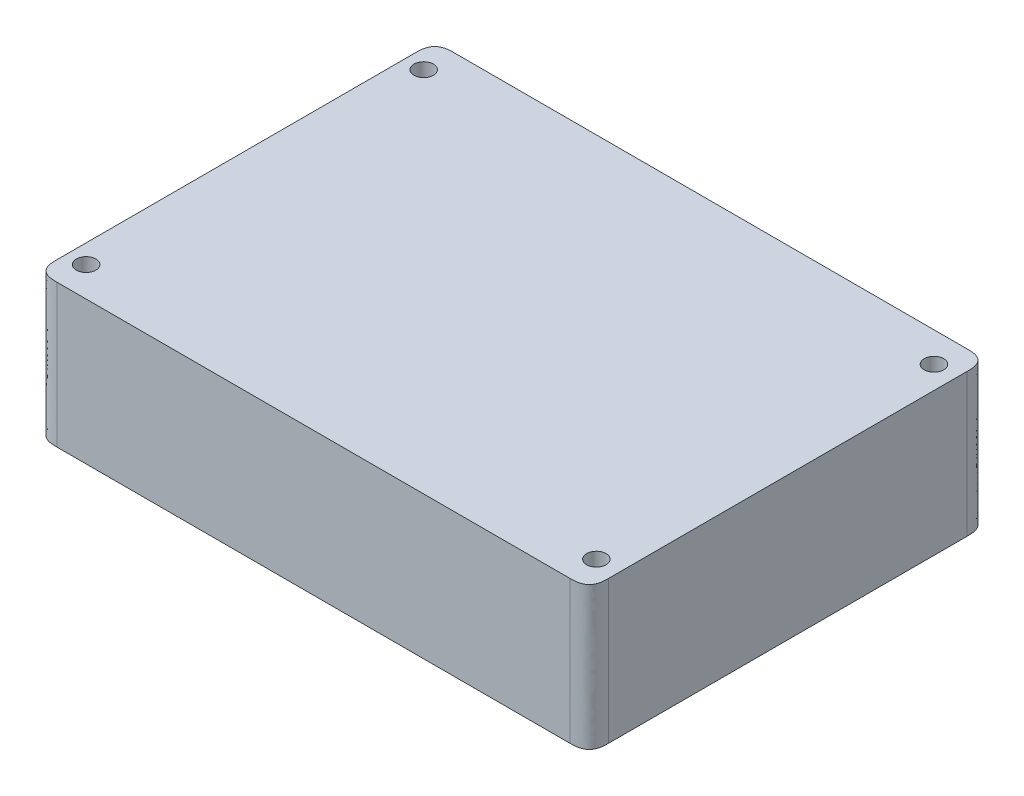
ISO-10303-21;
HEADER;
FILE_DESCRIPTION(('STEP AP214'),'2;1');
FILE_NAME('part.step','',(''),(''),'','','');
FILE_SCHEMA(('AUTOMOTIVE_DESIGN { 1 0 10303 214 1 1 1 1 }'));
ENDSEC;
DATA;
#1=APPLICATION_CONTEXT('core data for automotive mechanical design processes');
#2=APPLICATION_PROTOCOL_DEFINITION('international standard','automotive_design',2000,#1);
#3=PRODUCT_CONTEXT('',#1,'mechanical');
#4=PRODUCT('Part','Part','',(#3));
#5=PRODUCT_RELATED_PRODUCT_CATEGORY('part','',(#4));
#6=PRODUCT_DEFINITION_FORMATION('','',#4);
#7=PRODUCT_DEFINITION_CONTEXT('part definition',#1,'design');
#8=PRODUCT_DEFINITION('design','',#6,#7);
#9=PRODUCT_DEFINITION_SHAPE('','',#8);
#10=(LENGTH_UNIT() NAMED_UNIT(*) SI_UNIT(.MILLI.,.METRE.));
#11=(NAMED_UNIT(*) PLANE_ANGLE_UNIT() SI_UNIT($,.RADIAN.));
#12=(NAMED_UNIT(*) SI_UNIT($,.STERADIAN.) SOLID_ANGLE_UNIT());
#13=UNCERTAINTY_MEASURE_WITH_UNIT(LENGTH_MEASURE(1.E-05),#10,'distance_accuracy_value','');
#14=(GEOMETRIC_REPRESENTATION_CONTEXT(3) GLOBAL_UNCERTAINTY_ASSIGNED_CONTEXT((#13)) GLOBAL_UNIT_ASSIGNED_CONTEXT((#10,
#11,#12)) REPRESENTATION_CONTEXT('',''));
#15=CARTESIAN_POINT('',(0.,0.,0.));
#16=DIRECTION('',(0.,0.,1.));
#17=DIRECTION('',(1.,0.,0.));
#18=AXIS2_PLACEMENT_3D('',#15,#16,#17);
#19=CARTESIAN_POINT('',(0.,22.,0.));
#20=DIRECTION('',(0.,1.,0.));
#21=DIRECTION('',(0.,0.,1.));
#22=AXIS2_PLACEMENT_3D('',#19,#20,#21);
#23=PLANE('',#22);
#24=CARTESIAN_POINT('',(27.247027027027,22.,-21.6167567567567));
#25=DIRECTION('',(0.,1.,0.));
#26=DIRECTION('',(0.,0.,1.));
#27=AXIS2_PLACEMENT_3D('',#24,#25,#26);
#28=CIRCLE('',#27,1.5);
#29=CARTESIAN_POINT('',(27.247027027027,22.,-20.1167567567567));
#30=VERTEX_POINT('',#29);
#31=EDGE_CURVE('E262',#30,#30,#28,.T.);
#32=ORIENTED_EDGE('',*,*,#31,.F.);
#33=EDGE_LOOP('',(#32));
#34=FACE_BOUND('',#33,.T.);
#35=CARTESIAN_POINT('',(-51.352972972973,22.,-21.6167567567567));
#36=DIRECTION('',(0.,1.,0.));
#37=DIRECTION('',(0.,0.,1.));
#38=AXIS2_PLACEMENT_3D('',#35,#36,#37);
#39=CIRCLE('',#38,1.5);
#40=CARTESIAN_POINT('',(-51.352972972973,22.,-20.1167567567567));
#41=VERTEX_POINT('',#40);
#42=EDGE_CURVE('E155',#41,#41,#39,.T.);
#43=ORIENTED_EDGE('',*,*,#42,.F.);
#44=EDGE_LOOP('',(#43));
#45=FACE_BOUND('',#44,.T.);
#46=DIRECTION('',(-1.,0.,0.));
#47=VECTOR('',#46,1.);
#48=CARTESIAN_POINT('',(-54.252972972973,22.,-26.2167567567567));
#49=LINE('',#48,#47);
#50=CARTESIAN_POINT('',(27.747027027027,22.,-26.2167567567567));
#51=VERTEX_POINT('',#50);
#52=CARTESIAN_POINT('',(-51.252972972973,22.,-26.2167567567567));
#53=VERTEX_POINT('',#52);
#54=EDGE_CURVE('E218',#51,#53,#49,.T.);
#55=ORIENTED_EDGE('',*,*,#54,.T.);
#56=CARTESIAN_POINT('',(-54.252972972973,22.,-23.2167567567567));
#57=CARTESIAN_POINT('',(-54.252972972973,22.,-23.7213509113585));
#58=CARTESIAN_POINT('',(-54.252972972973,22.,-24.2259450659621));
#59=CARTESIAN_POINT('',(-54.0378972134682,22.,-25.3380771003164));
#60=CARTESIAN_POINT('',(-53.3742933165361,22.,-26.0016809972485));
#61=CARTESIAN_POINT('',(-52.2621612821837,22.,-26.2167567567567));
#62=CARTESIAN_POINT('',(-51.7575671275783,22.,-26.2167567567567));
#63=CARTESIAN_POINT('',(-51.252972972973,22.,-26.2167567567567));
#64=B_SPLINE_CURVE_WITH_KNOTS('',5,(#56,#57,#58,#59,#60,#61,#62,#63),.UNSPECIFIED.,.F.,.F.,(6,2,
6),(0.,0.5,1.),.UNSPECIFIED.);
#65=CARTESIAN_POINT('',(-54.252972972973,22.,-23.2167567567567));
#66=VERTEX_POINT('',#65);
#67=EDGE_CURVE('E356',#53,#66,#64,.F.);
#68=ORIENTED_EDGE('',*,*,#67,.T.);
#69=DIRECTION('',(0.,0.,1.));
#70=VECTOR('',#69,1.);
#71=CARTESIAN_POINT('',(-54.252972972973,22.,-26.2167567567567));
#72=LINE('',#71,#70);
#73=CARTESIAN_POINT('',(-54.252972972973,22.,31.9832432432433));
#74=VERTEX_POINT('',#73);
#75=EDGE_CURVE('E144',#66,#74,#72,.T.);
#76=ORIENTED_EDGE('',*,*,#75,.T.);
#77=CARTESIAN_POINT('',(-51.252972972973,22.,34.9832432432433));
#78=CARTESIAN_POINT('',(-51.7575671275749,22.,34.9832432432433));
#79=CARTESIAN_POINT('',(-52.2621612821767,22.,34.9832432432433));
#80=CARTESIAN_POINT('',(-53.3742933165327,22.,34.768167483735));
#81=CARTESIAN_POINT('',(-54.0378972134648,22.,34.1045635868029));
#82=CARTESIAN_POINT('',(-54.252972972973,22.,32.992431552447));
#83=CARTESIAN_POINT('',(-54.252972972973,22.,32.4878373978451));
#84=CARTESIAN_POINT('',(-54.252972972973,22.,31.9832432432433));
#85=B_SPLINE_CURVE_WITH_KNOTS('',5,(#77,#78,#79,#80,#81,#82,#83,#84),.UNSPECIFIED.,.F.,.F.,(6,2,
6),(0.,0.5,1.),.UNSPECIFIED.);
#86=CARTESIAN_POINT('',(-51.252972972973,22.,34.9832432432433));
#87=VERTEX_POINT('',#86);
#88=EDGE_CURVE('E353',#74,#87,#85,.F.);
#89=ORIENTED_EDGE('',*,*,#88,.T.);
#90=DIRECTION('',(1.,0.,0.));
#91=VECTOR('',#90,1.);
#92=CARTESIAN_POINT('',(-54.252972972973,22.,34.9832432432433));
#93=LINE('',#92,#91);
#94=CARTESIAN_POINT('',(27.747027027027,22.,34.9832432432433));
#95=VERTEX_POINT('',#94);
#96=EDGE_CURVE('E244',#87,#95,#93,.T.);
#97=ORIENTED_EDGE('',*,*,#96,.T.);
#98=CARTESIAN_POINT('',(30.747027027027,22.,31.9832432432433));
#99=CARTESIAN_POINT('',(30.747027027027,22.,32.4878373978451));
#100=CARTESIAN_POINT('',(30.747027027027,22.,32.992431552447));
#101=CARTESIAN_POINT('',(30.5319512675187,22.,34.1045635868029));
#102=CARTESIAN_POINT('',(29.8683473705866,22.,34.768167483735));
#103=CARTESIAN_POINT('',(28.7562153362307,22.,34.9832432432433));
#104=CARTESIAN_POINT('',(28.2516211816288,22.,34.9832432432433));
#105=CARTESIAN_POINT('',(27.747027027027,22.,34.9832432432433));
#106=B_SPLINE_CURVE_WITH_KNOTS('',5,(#98,#99,#100,#101,#102,#103,#104,#105),.UNSPECIFIED.,.F.,
.F.,(6,2,6),(0.,0.5,1.),.UNSPECIFIED.);
#107=CARTESIAN_POINT('',(30.747027027027,22.,31.9832432432433));
#108=VERTEX_POINT('',#107);
#109=EDGE_CURVE('E72',#95,#108,#106,.F.);
#110=ORIENTED_EDGE('',*,*,#109,.T.);
#111=DIRECTION('',(0.,0.,-1.));
#112=VECTOR('',#111,1.);
#113=CARTESIAN_POINT('',(30.747027027027,22.,-26.2167567567567));
#114=LINE('',#113,#112);
#115=CARTESIAN_POINT('',(30.747027027027,22.,-23.2167567567567));
#116=VERTEX_POINT('',#115);
#117=EDGE_CURVE('E226',#108,#116,#114,.T.);
#118=ORIENTED_EDGE('',*,*,#117,.T.);
#119=CARTESIAN_POINT('',(27.747027027027,22.,-26.2167567567567));
#120=CARTESIAN_POINT('',(28.2516211816288,22.,-26.2167567567567));
#121=CARTESIAN_POINT('',(28.7562153362307,22.,-26.2167567567567));
#122=CARTESIAN_POINT('',(29.8683473705866,22.,-26.0016809972485));
#123=CARTESIAN_POINT('',(30.5319512675187,22.,-25.3380771003164));
#124=CARTESIAN_POINT('',(30.747027027027,22.,-24.2259450659604));
#125=CARTESIAN_POINT('',(30.747027027027,22.,-23.7213509113586));
#126=CARTESIAN_POINT('',(30.747027027027,22.,-23.2167567567567));
#127=B_SPLINE_CURVE_WITH_KNOTS('',5,(#119,#120,#121,#122,#123,#124,#125,#126),.UNSPECIFIED.,.F.,
.F.,(6,2,6),(0.,0.5,1.),.UNSPECIFIED.);
#128=EDGE_CURVE('E362',#116,#51,#127,.F.);
#129=ORIENTED_EDGE('',*,*,#128,.T.);
#130=EDGE_LOOP('',(#55,#68,#76,#89,#97,#110,#118,#129));
#131=FACE_BOUND('',#130,.T.);
#132=CARTESIAN_POINT('',(-51.352972972973,22.,30.3832432432433));
#133=DIRECTION('',(0.,1.,0.));
#134=DIRECTION('',(0.,0.,1.));
#135=AXIS2_PLACEMENT_3D('',#132,#133,#134);
#136=CIRCLE('',#135,1.5);
#137=CARTESIAN_POINT('',(-51.352972972973,22.,31.8832432432433));
#138=VERTEX_POINT('',#137);
#139=EDGE_CURVE('E257',#138,#138,#136,.T.);
#140=ORIENTED_EDGE('',*,*,#139,.F.);
#141=EDGE_LOOP('',(#140));
#142=FACE_BOUND('',#141,.T.);
#143=CARTESIAN_POINT('',(27.247027027027,22.,30.3832432432433));
#144=DIRECTION('',(0.,1.,0.));
#145=DIRECTION('',(0.,0.,1.));
#146=AXIS2_PLACEMENT_3D('',#143,#144,#145);
#147=CIRCLE('',#146,1.5);
#148=CARTESIAN_POINT('',(27.247027027027,22.,31.8832432432433));
#149=VERTEX_POINT('',#148);
#150=EDGE_CURVE('E268',#149,#149,#147,.T.);
#151=ORIENTED_EDGE('',*,*,#150,.F.);
#152=EDGE_LOOP('',(#151));
#153=FACE_BOUND('',#152,.T.);
#154=ADVANCED_FACE('F43',(#34,#45,#131,#142,#153),#23,.T.);
#155=CARTESIAN_POINT('',(0.,0.,0.));
#156=DIRECTION('',(0.,1.,0.));
#157=DIRECTION('',(0.,0.,1.));
#158=AXIS2_PLACEMENT_3D('',#155,#156,#157);
#159=PLANE('',#158);
#160=DIRECTION('',(0.,0.,1.));
#161=VECTOR('',#160,1.);
#162=CARTESIAN_POINT('',(-54.252972972973,0.,-26.2167567567567));
#163=LINE('',#162,#161);
#164=CARTESIAN_POINT('',(-54.252972972973,0.,-23.2167567567567));
#165=VERTEX_POINT('',#164);
#166=CARTESIAN_POINT('',(-54.252972972973,0.,31.9832432432433));
#167=VERTEX_POINT('',#166);
#168=EDGE_CURVE('E141',#165,#167,#163,.T.);
#169=ORIENTED_EDGE('',*,*,#168,.F.);
#170=CARTESIAN_POINT('',(-51.252972972973,0.,-26.2167567567567));
#171=CARTESIAN_POINT('',(-51.757567127575,0.,-26.2167567567567));
#172=CARTESIAN_POINT('',(-52.262161282177,0.,-26.2167567567567));
#173=CARTESIAN_POINT('',(-53.3742933165328,0.,-26.0016809972485));
#174=CARTESIAN_POINT('',(-54.0378972134649,0.,-25.3380771003164));
#175=CARTESIAN_POINT('',(-54.252972972973,0.,-24.2259450659605));
#176=CARTESIAN_POINT('',(-54.252972972973,0.,-23.7213509113585));
#177=CARTESIAN_POINT('',(-54.252972972973,0.,-23.2167567567567));
#178=B_SPLINE_CURVE_WITH_KNOTS('',5,(#170,#171,#172,#173,#174,#175,#176,#177),.UNSPECIFIED.,.F.,
.F.,(6,2,6),(0.,0.5,1.),.UNSPECIFIED.);
#179=CARTESIAN_POINT('',(-51.252972972973,0.,-26.2167567567567));
#180=VERTEX_POINT('',#179);
#181=EDGE_CURVE('E118',#165,#180,#178,.F.);
#182=ORIENTED_EDGE('',*,*,#181,.T.);
#183=DIRECTION('',(-1.,0.,0.));
#184=VECTOR('',#183,1.);
#185=CARTESIAN_POINT('',(-54.252972972973,0.,-26.2167567567567));
#186=LINE('',#185,#184);
#187=CARTESIAN_POINT('',(27.747027027027,0.,-26.2167567567567));
#188=VERTEX_POINT('',#187);
#189=EDGE_CURVE('E324',#188,#180,#186,.T.);
#190=ORIENTED_EDGE('',*,*,#189,.F.);
#191=CARTESIAN_POINT('',(30.747027027027,0.,-23.2167567567567));
#192=CARTESIAN_POINT('',(30.747027027027,0.,-23.7213509113586));
#193=CARTESIAN_POINT('',(30.747027027027,0.,-24.2259450659604));
#194=CARTESIAN_POINT('',(30.5319512675187,0.,-25.3380771003164));
#195=CARTESIAN_POINT('',(29.8683473705866,0.,-26.0016809972485));
#196=CARTESIAN_POINT('',(28.7562153362307,0.,-26.2167567567567));
#197=CARTESIAN_POINT('',(28.2516211816288,0.,-26.2167567567567));
#198=CARTESIAN_POINT('',(27.747027027027,0.,-26.2167567567567));
#199=B_SPLINE_CURVE_WITH_KNOTS('',5,(#191,#192,#193,#194,#195,#196,#197,#198),.UNSPECIFIED.,.F.,
.F.,(6,2,6),(0.,0.5,1.),.UNSPECIFIED.);
#200=CARTESIAN_POINT('',(30.747027027027,0.,-23.2167567567567));
#201=VERTEX_POINT('',#200);
#202=EDGE_CURVE('E133',#188,#201,#199,.F.);
#203=ORIENTED_EDGE('',*,*,#202,.T.);
#204=DIRECTION('',(0.,0.,-1.));
#205=VECTOR('',#204,1.);
#206=CARTESIAN_POINT('',(30.747027027027,0.,-26.2167567567567));
#207=LINE('',#206,#205);
#208=CARTESIAN_POINT('',(30.747027027027,0.,31.9832432432433));
#209=VERTEX_POINT('',#208);
#210=EDGE_CURVE('E158',#209,#201,#207,.T.);
#211=ORIENTED_EDGE('',*,*,#210,.F.);
#212=CARTESIAN_POINT('',(27.747027027027,0.,34.9832432432433));
#213=CARTESIAN_POINT('',(28.2516211816288,0.,34.9832432432433));
#214=CARTESIAN_POINT('',(28.7562153362307,0.,34.9832432432433));
#215=CARTESIAN_POINT('',(29.8683473705866,0.,34.768167483735));
#216=CARTESIAN_POINT('',(30.5319512675187,0.,34.1045635868029));
#217=CARTESIAN_POINT('',(30.747027027027,0.,32.992431552447));
#218=CARTESIAN_POINT('',(30.747027027027,0.,32.4878373978451));
#219=CARTESIAN_POINT('',(30.747027027027,0.,31.9832432432433));
#220=B_SPLINE_CURVE_WITH_KNOTS('',5,(#212,#213,#214,#215,#216,#217,#218,#219),.UNSPECIFIED.,.F.,
.F.,(6,2,6),(0.,0.5,1.),.UNSPECIFIED.);
#221=CARTESIAN_POINT('',(27.747027027027,0.,34.9832432432433));
#222=VERTEX_POINT('',#221);
#223=EDGE_CURVE('E145',#209,#222,#220,.F.);
#224=ORIENTED_EDGE('',*,*,#223,.T.);
#225=DIRECTION('',(1.,0.,0.));
#226=VECTOR('',#225,1.);
#227=CARTESIAN_POINT('',(-54.252972972973,0.,34.9832432432433));
#228=LINE('',#227,#226);
#229=CARTESIAN_POINT('',(-51.252972972973,0.,34.9832432432433));
#230=VERTEX_POINT('',#229);
#231=EDGE_CURVE('E154',#230,#222,#228,.T.);
#232=ORIENTED_EDGE('',*,*,#231,.F.);
#233=CARTESIAN_POINT('',(-54.252972972973,0.,31.9832432432433));
#234=CARTESIAN_POINT('',(-54.252972972973,0.,32.4878373978451));
#235=CARTESIAN_POINT('',(-54.252972972973,0.,32.992431552447));
#236=CARTESIAN_POINT('',(-54.0378972134648,0.,34.1045635868029));
#237=CARTESIAN_POINT('',(-53.3742933165327,0.,34.768167483735));
#238=CARTESIAN_POINT('',(-52.2621612821767,0.,34.9832432432433));
#239=CARTESIAN_POINT('',(-51.7575671275748,0.,34.9832432432433));
#240=CARTESIAN_POINT('',(-51.252972972973,0.,34.9832432432433));
#241=B_SPLINE_CURVE_WITH_KNOTS('',5,(#233,#234,#235,#236,#237,#238,#239,#240),.UNSPECIFIED.,.F.,
.F.,(6,2,6),(0.,0.5,1.),.UNSPECIFIED.);
#242=EDGE_CURVE('E152',#230,#167,#241,.F.);
#243=ORIENTED_EDGE('',*,*,#242,.T.);
#244=EDGE_LOOP('',(#169,#182,#190,#203,#211,#224,#232,#243));
#245=FACE_BOUND('',#244,.T.);
#246=CARTESIAN_POINT('',(-51.352972972973,0.,-21.6167567567567));
#247=DIRECTION('',(0.,1.,0.));
#248=DIRECTION('',(0.,0.,1.));
#249=AXIS2_PLACEMENT_3D('',#246,#247,#248);
#250=CIRCLE('',#249,1.5);
#251=CARTESIAN_POINT('',(-51.352972972973,0.,-20.1167567567567));
#252=VERTEX_POINT('',#251);
#253=EDGE_CURVE('E161',#252,#252,#250,.T.);
#254=ORIENTED_EDGE('',*,*,#253,.T.);
#255=EDGE_LOOP('',(#254));
#256=FACE_BOUND('',#255,.T.);
#257=CARTESIAN_POINT('',(-51.352972972973,0.,30.3832432432433));
#258=DIRECTION('',(0.,1.,0.));
#259=DIRECTION('',(0.,0.,1.));
#260=AXIS2_PLACEMENT_3D('',#257,#258,#259);
#261=CIRCLE('',#260,1.5);
#262=CARTESIAN_POINT('',(-51.352972972973,0.,31.8832432432433));
#263=VERTEX_POINT('',#262);
#264=EDGE_CURVE('E259',#263,#263,#261,.T.);
#265=ORIENTED_EDGE('',*,*,#264,.T.);
#266=EDGE_LOOP('',(#265));
#267=FACE_BOUND('',#266,.T.);
#268=CARTESIAN_POINT('',(27.247027027027,0.,-21.6167567567567));
#269=DIRECTION('',(0.,1.,0.));
#270=DIRECTION('',(0.,0.,1.));
#271=AXIS2_PLACEMENT_3D('',#268,#269,#270);
#272=CIRCLE('',#271,1.5);
#273=CARTESIAN_POINT('',(27.247027027027,0.,-20.1167567567567));
#274=VERTEX_POINT('',#273);
#275=EDGE_CURVE('E265',#274,#274,#272,.T.);
#276=ORIENTED_EDGE('',*,*,#275,.T.);
#277=EDGE_LOOP('',(#276));
#278=FACE_BOUND('',#277,.T.);
#279=CARTESIAN_POINT('',(27.247027027027,0.,30.3832432432433));
#280=DIRECTION('',(0.,1.,0.));
#281=DIRECTION('',(0.,0.,1.));
#282=AXIS2_PLACEMENT_3D('',#279,#280,#281);
#283=CIRCLE('',#282,1.5);
#284=CARTESIAN_POINT('',(27.247027027027,0.,31.8832432432433));
#285=VERTEX_POINT('',#284);
#286=EDGE_CURVE('E271',#285,#285,#283,.T.);
#287=ORIENTED_EDGE('',*,*,#286,.T.);
#288=EDGE_LOOP('',(#287));
#289=FACE_BOUND('',#288,.T.);
#290=ADVANCED_FACE('F149',(#245,#256,#267,#278,#289),#159,.F.);
#291=CARTESIAN_POINT('',(-54.252972972973,22.,-26.2167567567567));
#292=DIRECTION('',(1.,0.,0.));
#293=DIRECTION('',(0.,0.,-1.));
#294=AXIS2_PLACEMENT_3D('',#291,#292,#293);
#295=PLANE('',#294);
#296=ORIENTED_EDGE('',*,*,#75,.F.);
#297=CARTESIAN_POINT('',(-54.252972972973,-1.1,-23.2167567567567));
#298=CARTESIAN_POINT('',(-54.252972972973,6.96666666666667,-23.2167567567567));
#299=CARTESIAN_POINT('',(-54.252972972973,15.0333333333106,-23.2167567567567));
#300=CARTESIAN_POINT('',(-54.252972972973,23.1,-23.2167567567567));
#301=B_SPLINE_CURVE_WITH_KNOTS('',3,(#297,#298,#299,#300),.UNSPECIFIED.,.F.,.F.,(4,4),(-0.0011,
0.0231),.UNSPECIFIED.);
#302=EDGE_CURVE('E123',#66,#165,#301,.F.);
#303=ORIENTED_EDGE('',*,*,#302,.T.);
#304=ORIENTED_EDGE('',*,*,#168,.T.);
#305=CARTESIAN_POINT('',(-54.252972972973,23.1,31.9832432432433));
#306=CARTESIAN_POINT('',(-54.252972972973,15.0333333333106,31.9832432432433));
#307=CARTESIAN_POINT('',(-54.252972972973,6.96666666666667,31.9832432432433));
#308=CARTESIAN_POINT('',(-54.252972972973,-1.1,31.9832432432433));
#309=B_SPLINE_CURVE_WITH_KNOTS('',3,(#305,#306,#307,#308),.UNSPECIFIED.,.F.,.F.,(4,4),(-0.0011,
0.0231),.UNSPECIFIED.);
#310=EDGE_CURVE('E146',#167,#74,#309,.F.);
#311=ORIENTED_EDGE('',*,*,#310,.T.);
#312=EDGE_LOOP('',(#296,#303,#304,#311));
#313=FACE_BOUND('',#312,.T.);
#314=ADVANCED_FACE('F140',(#313),#295,.F.);
#315=CARTESIAN_POINT('',(-54.252972972973,22.,34.9832432432433));
#316=DIRECTION('',(0.,0.,-1.));
#317=DIRECTION('',(-1.,0.,0.));
#318=AXIS2_PLACEMENT_3D('',#315,#316,#317);
#319=PLANE('',#318);
#320=ORIENTED_EDGE('',*,*,#96,.F.);
#321=CARTESIAN_POINT('',(-51.252972972973,-1.1,34.9832432432433));
#322=CARTESIAN_POINT('',(-51.252972972973,6.96666666666667,34.9832432432433));
#323=CARTESIAN_POINT('',(-51.252972972973,15.0333333333106,34.9832432432433));
#324=CARTESIAN_POINT('',(-51.252972972973,23.1,34.9832432432433));
#325=B_SPLINE_CURVE_WITH_KNOTS('',3,(#321,#322,#323,#324),.UNSPECIFIED.,.F.,.F.,(4,4),(-0.0011,
0.0231),.UNSPECIFIED.);
#326=EDGE_CURVE('E11',#87,#230,#325,.F.);
#327=ORIENTED_EDGE('',*,*,#326,.T.);
#328=ORIENTED_EDGE('',*,*,#231,.T.);
#329=CARTESIAN_POINT('',(27.747027027027,23.1,34.9832432432433));
#330=CARTESIAN_POINT('',(27.747027027027,15.0333333333106,34.9832432432433));
#331=CARTESIAN_POINT('',(27.747027027027,6.96666666666667,34.9832432432433));
#332=CARTESIAN_POINT('',(27.747027027027,-1.1,34.9832432432433));
#333=B_SPLINE_CURVE_WITH_KNOTS('',3,(#329,#330,#331,#332),.UNSPECIFIED.,.F.,.F.,(4,4),(-0.0011,
0.0231),.UNSPECIFIED.);
#334=EDGE_CURVE('E57',#222,#95,#333,.F.);
#335=ORIENTED_EDGE('',*,*,#334,.T.);
#336=EDGE_LOOP('',(#320,#327,#328,#335));
#337=FACE_BOUND('',#336,.T.);
#338=ADVANCED_FACE('F323',(#337),#319,.F.);
#339=CARTESIAN_POINT('',(30.747027027027,22.,-26.2167567567567));
#340=DIRECTION('',(-1.,0.,0.));
#341=DIRECTION('',(0.,0.,1.));
#342=AXIS2_PLACEMENT_3D('',#339,#340,#341);
#343=PLANE('',#342);
#344=ORIENTED_EDGE('',*,*,#210,.T.);
#345=CARTESIAN_POINT('',(30.747027027027,23.1,-23.2167567567567));
#346=CARTESIAN_POINT('',(30.747027027027,15.0333333333106,-23.2167567567567));
#347=CARTESIAN_POINT('',(30.747027027027,6.96666666666667,-23.2167567567567));
#348=CARTESIAN_POINT('',(30.747027027027,-1.1,-23.2167567567567));
#349=B_SPLINE_CURVE_WITH_KNOTS('',3,(#345,#346,#347,#348),.UNSPECIFIED.,.F.,.F.,(4,4),(-0.0011,
0.0231),.UNSPECIFIED.);
#350=EDGE_CURVE('E64',#201,#116,#349,.F.);
#351=ORIENTED_EDGE('',*,*,#350,.T.);
#352=ORIENTED_EDGE('',*,*,#117,.F.);
#353=CARTESIAN_POINT('',(30.747027027027,-1.1,31.9832432432433));
#354=CARTESIAN_POINT('',(30.747027027027,6.96666666666667,31.9832432432433));
#355=CARTESIAN_POINT('',(30.747027027027,15.0333333333106,31.9832432432433));
#356=CARTESIAN_POINT('',(30.747027027027,23.1,31.9832432432433));
#357=B_SPLINE_CURVE_WITH_KNOTS('',3,(#353,#354,#355,#356),.UNSPECIFIED.,.F.,.F.,(4,4),(-0.0011,
0.0231),.UNSPECIFIED.);
#358=EDGE_CURVE('E420',#108,#209,#357,.F.);
#359=ORIENTED_EDGE('',*,*,#358,.T.);
#360=EDGE_LOOP('',(#344,#351,#352,#359));
#361=FACE_BOUND('',#360,.T.);
#362=ADVANCED_FACE('F317',(#361),#343,.F.);
#363=CARTESIAN_POINT('',(-54.252972972973,22.,-26.2167567567567));
#364=DIRECTION('',(0.,0.,1.));
#365=DIRECTION('',(1.,0.,0.));
#366=AXIS2_PLACEMENT_3D('',#363,#364,#365);
#367=PLANE('',#366);
#368=ORIENTED_EDGE('',*,*,#189,.T.);
#369=CARTESIAN_POINT('',(-51.252972972973,23.1,-26.2167567567567));
#370=CARTESIAN_POINT('',(-51.252972972973,15.0333333333106,-26.2167567567567));
#371=CARTESIAN_POINT('',(-51.252972972973,6.96666666666667,-26.2167567567567));
#372=CARTESIAN_POINT('',(-51.252972972973,-1.1,-26.2167567567567));
#373=B_SPLINE_CURVE_WITH_KNOTS('',3,(#369,#370,#371,#372),.UNSPECIFIED.,.F.,.F.,(4,4),(-0.0011,
0.0231),.UNSPECIFIED.);
#374=EDGE_CURVE('E125',#180,#53,#373,.F.);
#375=ORIENTED_EDGE('',*,*,#374,.T.);
#376=ORIENTED_EDGE('',*,*,#54,.F.);
#377=CARTESIAN_POINT('',(27.747027027027,-1.1,-26.2167567567567));
#378=CARTESIAN_POINT('',(27.747027027027,6.96666666666667,-26.2167567567567));
#379=CARTESIAN_POINT('',(27.747027027027,15.0333333333106,-26.2167567567567));
#380=CARTESIAN_POINT('',(27.747027027027,23.1,-26.2167567567567));
#381=B_SPLINE_CURVE_WITH_KNOTS('',3,(#377,#378,#379,#380),.UNSPECIFIED.,.F.,.F.,(4,4),(-0.0011,
0.0231),.UNSPECIFIED.);
#382=EDGE_CURVE('E132',#51,#188,#381,.F.);
#383=ORIENTED_EDGE('',*,*,#382,.T.);
#384=EDGE_LOOP('',(#368,#375,#376,#383));
#385=FACE_BOUND('',#384,.T.);
#386=ADVANCED_FACE('F197',(#385),#367,.F.);
#387=CARTESIAN_POINT('',(-51.352972972973,22.,-21.6167567567567));
#388=DIRECTION('',(0.,-1.,0.));
#389=DIRECTION('',(0.,0.,-1.));
#390=AXIS2_PLACEMENT_3D('',#387,#388,#389);
#391=CYLINDRICAL_SURFACE('',#390,1.5);
#392=ORIENTED_EDGE('',*,*,#42,.T.);
#393=EDGE_LOOP('',(#392));
#394=FACE_BOUND('',#393,.T.);
#395=ORIENTED_EDGE('',*,*,#253,.F.);
#396=EDGE_LOOP('',(#395));
#397=FACE_BOUND('',#396,.T.);
#398=ADVANCED_FACE('F294',(#394,#397),#391,.F.);
#399=CARTESIAN_POINT('',(-51.352972972973,22.,30.3832432432433));
#400=DIRECTION('',(0.,-1.,0.));
#401=DIRECTION('',(0.,0.,-1.));
#402=AXIS2_PLACEMENT_3D('',#399,#400,#401);
#403=CYLINDRICAL_SURFACE('',#402,1.5);
#404=ORIENTED_EDGE('',*,*,#139,.T.);
#405=EDGE_LOOP('',(#404));
#406=FACE_BOUND('',#405,.T.);
#407=ORIENTED_EDGE('',*,*,#264,.F.);
#408=EDGE_LOOP('',(#407));
#409=FACE_BOUND('',#408,.T.);
#410=ADVANCED_FACE('F290',(#406,#409),#403,.F.);
#411=CARTESIAN_POINT('',(27.247027027027,22.,-21.6167567567567));
#412=DIRECTION('',(0.,-1.,0.));
#413=DIRECTION('',(0.,0.,-1.));
#414=AXIS2_PLACEMENT_3D('',#411,#412,#413);
#415=CYLINDRICAL_SURFACE('',#414,1.5);
#416=ORIENTED_EDGE('',*,*,#31,.T.);
#417=EDGE_LOOP('',(#416));
#418=FACE_BOUND('',#417,.T.);
#419=ORIENTED_EDGE('',*,*,#275,.F.);
#420=EDGE_LOOP('',(#419));
#421=FACE_BOUND('',#420,.T.);
#422=ADVANCED_FACE('F293',(#418,#421),#415,.F.);
#423=CARTESIAN_POINT('',(27.247027027027,22.,30.3832432432433));
#424=DIRECTION('',(0.,-1.,0.));
#425=DIRECTION('',(0.,0.,-1.));
#426=AXIS2_PLACEMENT_3D('',#423,#424,#425);
#427=CYLINDRICAL_SURFACE('',#426,1.5);
#428=ORIENTED_EDGE('',*,*,#150,.T.);
#429=EDGE_LOOP('',(#428));
#430=FACE_BOUND('',#429,.T.);
#431=ORIENTED_EDGE('',*,*,#286,.F.);
#432=EDGE_LOOP('',(#431));
#433=FACE_BOUND('',#432,.T.);
#434=ADVANCED_FACE('F277',(#430,#433),#427,.F.);
#435=CARTESIAN_POINT('',(-54.252972972973,23.1,-23.2167567567567));
#436=CARTESIAN_POINT('',(-54.252972972973,15.0333333333106,-23.2167567567567));
#437=CARTESIAN_POINT('',(-54.252972972973,6.96666666666667,-23.2167567567567));
#438=CARTESIAN_POINT('',(-54.252972972973,-1.1,-23.2167567567567));
#439=CARTESIAN_POINT('',(-54.252972972973,23.1,-23.7213509113585));
#440=CARTESIAN_POINT('',(-54.252972972973,15.0333333333106,-23.7213509113585));
#441=CARTESIAN_POINT('',(-54.252972972973,6.96666666666667,-23.7213509113585));
#442=CARTESIAN_POINT('',(-54.252972972973,-1.1,-23.7213509113585));
#443=CARTESIAN_POINT('',(-54.252972972973,23.1,-24.2259450659604));
#444=CARTESIAN_POINT('',(-54.252972972973,15.0333333333106,-24.2259450659744));
#445=CARTESIAN_POINT('',(-54.252972972973,6.96666666666667,-24.2259450659604));
#446=CARTESIAN_POINT('',(-54.252972972973,-1.1,-24.2259450659604));
#447=CARTESIAN_POINT('',(-54.0378972134648,23.1,-25.3380771003164));
#448=CARTESIAN_POINT('',(-54.0378972134927,15.0333333333106,-25.3380771003164));
#449=CARTESIAN_POINT('',(-54.0378972134648,6.96666666666667,-25.3380771003164));
#450=CARTESIAN_POINT('',(-54.0378972134648,-1.1,-25.3380771003164));
#451=CARTESIAN_POINT('',(-53.3742933165327,23.1,-26.0016809972485));
#452=CARTESIAN_POINT('',(-53.3742933165606,15.0333333333106,-26.0016809972485));
#453=CARTESIAN_POINT('',(-53.3742933165327,6.96666666666667,-26.0016809972485));
#454=CARTESIAN_POINT('',(-53.3742933165327,-1.1,-26.0016809972485));
#455=CARTESIAN_POINT('',(-52.2621612821767,23.1,-26.2167567567567));
#456=CARTESIAN_POINT('',(-52.2621612822327,15.0333333333106,-26.2167567567567));
#457=CARTESIAN_POINT('',(-52.2621612821767,6.96666666666667,-26.2167567567567));
#458=CARTESIAN_POINT('',(-52.2621612821767,-1.1,-26.2167567567567));
#459=CARTESIAN_POINT('',(-51.7575671275749,23.1,-26.2167567567567));
#460=CARTESIAN_POINT('',(-51.7575671276028,15.0333333333106,-26.2167567567567));
#461=CARTESIAN_POINT('',(-51.7575671275749,6.96666666666667,-26.2167567567567));
#462=CARTESIAN_POINT('',(-51.7575671275749,-1.1,-26.2167567567567));
#463=CARTESIAN_POINT('',(-51.252972972973,23.1,-26.2167567567567));
#464=CARTESIAN_POINT('',(-51.252972972973,15.0333333333106,-26.2167567567567));
#465=CARTESIAN_POINT('',(-51.252972972973,6.96666666666667,-26.2167567567567));
#466=CARTESIAN_POINT('',(-51.252972972973,-1.1,-26.2167567567567));
#467=B_SPLINE_SURFACE_WITH_KNOTS('',5,3,((#435,#436,#437,#438),(#439,#440,#441,#442),(#443,#444,
#445,#446),(#447,#448,#449,#450),(#451,#452,#453,#454),(#455,#456,#457,#458),(#459,#460,#461,
#462),(#463,#464,#465,#466)),.UNSPECIFIED.,.F.,.F.,.F.,(6,2,6),(4,4),(0.,0.5,1.),(-0.0011,
0.0231),.UNSPECIFIED.);
#468=ORIENTED_EDGE('',*,*,#67,.F.);
#469=ORIENTED_EDGE('',*,*,#374,.F.);
#470=ORIENTED_EDGE('',*,*,#181,.F.);
#471=ORIENTED_EDGE('',*,*,#302,.F.);
#472=EDGE_LOOP('',(#468,#469,#470,#471));
#473=FACE_BOUND('',#472,.T.);
#474=ADVANCED_FACE('F122',(#473),#467,.T.);
#475=CARTESIAN_POINT('',(27.747027027027,23.1,-26.2167567567567));
#476=CARTESIAN_POINT('',(27.747027027027,15.0333333333106,-26.2167567567567));
#477=CARTESIAN_POINT('',(27.747027027027,6.96666666666667,-26.2167567567567));
#478=CARTESIAN_POINT('',(27.747027027027,-1.1,-26.2167567567567));
#479=CARTESIAN_POINT('',(28.2516211816288,23.1,-26.2167567567567));
#480=CARTESIAN_POINT('',(28.2516211816288,15.0333333333106,-26.2167567567567));
#481=CARTESIAN_POINT('',(28.2516211816288,6.96666666666667,-26.2167567567567));
#482=CARTESIAN_POINT('',(28.2516211816288,-1.1,-26.2167567567567));
#483=CARTESIAN_POINT('',(28.7562153362307,23.1,-26.2167567567567));
#484=CARTESIAN_POINT('',(28.7562153362307,15.0333333333106,-26.2167567567567));
#485=CARTESIAN_POINT('',(28.7562153362307,6.96666666666667,-26.2167567567567));
#486=CARTESIAN_POINT('',(28.7562153362307,-1.1,-26.2167567567567));
#487=CARTESIAN_POINT('',(29.8683473705866,23.1,-26.0016809972485));
#488=CARTESIAN_POINT('',(29.8683473705866,15.0333333333106,-26.0016809972485));
#489=CARTESIAN_POINT('',(29.8683473705866,6.96666666666667,-26.0016809972485));
#490=CARTESIAN_POINT('',(29.8683473705866,-1.1,-26.0016809972485));
#491=CARTESIAN_POINT('',(30.5319512675187,23.1,-25.3380771003164));
#492=CARTESIAN_POINT('',(30.5319512675187,15.0333333333106,-25.3380771003164));
#493=CARTESIAN_POINT('',(30.5319512675187,6.96666666666667,-25.3380771003164));
#494=CARTESIAN_POINT('',(30.5319512675187,-1.1,-25.3380771003164));
#495=CARTESIAN_POINT('',(30.747027027027,23.1,-24.2259450659604));
#496=CARTESIAN_POINT('',(30.747027027027,15.0333333333106,-24.2259450659604));
#497=CARTESIAN_POINT('',(30.747027027027,6.96666666666667,-24.2259450659604));
#498=CARTESIAN_POINT('',(30.747027027027,-1.1,-24.2259450659604));
#499=CARTESIAN_POINT('',(30.747027027027,23.1,-23.7213509113586));
#500=CARTESIAN_POINT('',(30.747027027027,15.0333333333106,-23.7213509113586));
#501=CARTESIAN_POINT('',(30.747027027027,6.96666666666667,-23.7213509113586));
#502=CARTESIAN_POINT('',(30.747027027027,-1.1,-23.7213509113586));
#503=CARTESIAN_POINT('',(30.747027027027,23.1,-23.2167567567567));
#504=CARTESIAN_POINT('',(30.747027027027,15.0333333333106,-23.2167567567567));
#505=CARTESIAN_POINT('',(30.747027027027,6.96666666666667,-23.2167567567567));
#506=CARTESIAN_POINT('',(30.747027027027,-1.1,-23.2167567567567));
#507=B_SPLINE_SURFACE_WITH_KNOTS('',5,3,((#475,#476,#477,#478),(#479,#480,#481,#482),(#483,#484,
#485,#486),(#487,#488,#489,#490),(#491,#492,#493,#494),(#495,#496,#497,#498),(#499,#500,#501,
#502),(#503,#504,#505,#506)),.UNSPECIFIED.,.F.,.F.,.F.,(6,2,6),(4,4),(0.,0.5,1.),(-0.0011,
0.0231),.UNSPECIFIED.);
#508=ORIENTED_EDGE('',*,*,#128,.F.);
#509=ORIENTED_EDGE('',*,*,#350,.F.);
#510=ORIENTED_EDGE('',*,*,#202,.F.);
#511=ORIENTED_EDGE('',*,*,#382,.F.);
#512=EDGE_LOOP('',(#508,#509,#510,#511));
#513=FACE_BOUND('',#512,.T.);
#514=ADVANCED_FACE('F308',(#513),#507,.T.);
#515=CARTESIAN_POINT('',(-51.252972972973,23.1,34.9832432432433));
#516=CARTESIAN_POINT('',(-51.252972972973,15.0333333333106,34.9832432432433));
#517=CARTESIAN_POINT('',(-51.252972972973,6.96666666666667,34.9832432432433));
#518=CARTESIAN_POINT('',(-51.252972972973,-1.1,34.9832432432433));
#519=CARTESIAN_POINT('',(-51.7575671275749,23.1,34.9832432432433));
#520=CARTESIAN_POINT('',(-51.7575671275749,15.0333333333106,34.9832432432433));
#521=CARTESIAN_POINT('',(-51.7575671275749,6.96666666666667,34.9832432432433));
#522=CARTESIAN_POINT('',(-51.7575671275749,-1.1,34.9832432432433));
#523=CARTESIAN_POINT('',(-52.2621612821767,23.1,34.9832432432433));
#524=CARTESIAN_POINT('',(-52.2621612821767,15.0333333333106,34.9832432432433));
#525=CARTESIAN_POINT('',(-52.2621612821767,6.96666666666667,34.9832432432433));
#526=CARTESIAN_POINT('',(-52.2621612821767,-1.1,34.9832432432433));
#527=CARTESIAN_POINT('',(-53.3742933165327,23.1,34.768167483735));
#528=CARTESIAN_POINT('',(-53.3742933165327,15.0333333333106,34.768167483735));
#529=CARTESIAN_POINT('',(-53.3742933165327,6.96666666666667,34.768167483735));
#530=CARTESIAN_POINT('',(-53.3742933165327,-1.1,34.768167483735));
#531=CARTESIAN_POINT('',(-54.0378972134648,23.1,34.1045635868029));
#532=CARTESIAN_POINT('',(-54.0378972134648,15.0333333333106,34.1045635868029));
#533=CARTESIAN_POINT('',(-54.0378972134648,6.96666666666667,34.1045635868029));
#534=CARTESIAN_POINT('',(-54.0378972134648,-1.1,34.1045635868029));
#535=CARTESIAN_POINT('',(-54.252972972973,23.1,32.992431552447));
#536=CARTESIAN_POINT('',(-54.252972972973,15.0333333333106,32.992431552447));
#537=CARTESIAN_POINT('',(-54.252972972973,6.96666666666667,32.992431552447));
#538=CARTESIAN_POINT('',(-54.252972972973,-1.1,32.992431552447));
#539=CARTESIAN_POINT('',(-54.252972972973,23.1,32.4878373978451));
#540=CARTESIAN_POINT('',(-54.252972972973,15.0333333333106,32.4878373978451));
#541=CARTESIAN_POINT('',(-54.252972972973,6.96666666666667,32.4878373978451));
#542=CARTESIAN_POINT('',(-54.252972972973,-1.1,32.4878373978451));
#543=CARTESIAN_POINT('',(-54.252972972973,23.1,31.9832432432433));
#544=CARTESIAN_POINT('',(-54.252972972973,15.0333333333106,31.9832432432433));
#545=CARTESIAN_POINT('',(-54.252972972973,6.96666666666667,31.9832432432433));
#546=CARTESIAN_POINT('',(-54.252972972973,-1.1,31.9832432432433));
#547=B_SPLINE_SURFACE_WITH_KNOTS('',5,3,((#515,#516,#517,#518),(#519,#520,#521,#522),(#523,#524,
#525,#526),(#527,#528,#529,#530),(#531,#532,#533,#534),(#535,#536,#537,#538),(#539,#540,#541,
#542),(#543,#544,#545,#546)),.UNSPECIFIED.,.F.,.F.,.F.,(6,2,6),(4,4),(0.,0.5,1.),(-0.0011,
0.0231),.UNSPECIFIED.);
#548=ORIENTED_EDGE('',*,*,#88,.F.);
#549=ORIENTED_EDGE('',*,*,#310,.F.);
#550=ORIENTED_EDGE('',*,*,#242,.F.);
#551=ORIENTED_EDGE('',*,*,#326,.F.);
#552=EDGE_LOOP('',(#548,#549,#550,#551));
#553=FACE_BOUND('',#552,.T.);
#554=ADVANCED_FACE('F360',(#553),#547,.T.);
#555=CARTESIAN_POINT('',(30.747027027027,23.1,31.9832432432433));
#556=CARTESIAN_POINT('',(30.747027027027,15.0333333333106,31.9832432432433));
#557=CARTESIAN_POINT('',(30.747027027027,6.96666666666667,31.9832432432433));
#558=CARTESIAN_POINT('',(30.747027027027,-1.1,31.9832432432433));
#559=CARTESIAN_POINT('',(30.747027027027,23.1,32.4878373978451));
#560=CARTESIAN_POINT('',(30.747027027027,15.0333333333106,32.4878373978451));
#561=CARTESIAN_POINT('',(30.747027027027,6.96666666666667,32.4878373978451));
#562=CARTESIAN_POINT('',(30.747027027027,-1.1,32.4878373978451));
#563=CARTESIAN_POINT('',(30.747027027027,23.1,32.992431552447));
#564=CARTESIAN_POINT('',(30.747027027027,15.0333333333106,32.992431552447));
#565=CARTESIAN_POINT('',(30.747027027027,6.96666666666667,32.992431552447));
#566=CARTESIAN_POINT('',(30.747027027027,-1.1,32.992431552447));
#567=CARTESIAN_POINT('',(30.5319512675187,23.1,34.1045635868029));
#568=CARTESIAN_POINT('',(30.5319512675187,15.0333333333106,34.1045635868029));
#569=CARTESIAN_POINT('',(30.5319512675187,6.96666666666667,34.1045635868029));
#570=CARTESIAN_POINT('',(30.5319512675187,-1.1,34.1045635868029));
#571=CARTESIAN_POINT('',(29.8683473705866,23.1,34.768167483735));
#572=CARTESIAN_POINT('',(29.8683473705866,15.0333333333106,34.768167483735));
#573=CARTESIAN_POINT('',(29.8683473705866,6.96666666666667,34.768167483735));
#574=CARTESIAN_POINT('',(29.8683473705866,-1.1,34.768167483735));
#575=CARTESIAN_POINT('',(28.7562153362307,23.1,34.9832432432433));
#576=CARTESIAN_POINT('',(28.7562153362307,15.0333333333106,34.9832432432433));
#577=CARTESIAN_POINT('',(28.7562153362307,6.96666666666667,34.9832432432433));
#578=CARTESIAN_POINT('',(28.7562153362307,-1.1,34.9832432432433));
#579=CARTESIAN_POINT('',(28.2516211816288,23.1,34.9832432432433));
#580=CARTESIAN_POINT('',(28.2516211816288,15.0333333333106,34.9832432432433));
#581=CARTESIAN_POINT('',(28.2516211816288,6.96666666666667,34.9832432432433));
#582=CARTESIAN_POINT('',(28.2516211816288,-1.1,34.9832432432433));
#583=CARTESIAN_POINT('',(27.747027027027,23.1,34.9832432432433));
#584=CARTESIAN_POINT('',(27.747027027027,15.0333333333106,34.9832432432433));
#585=CARTESIAN_POINT('',(27.747027027027,6.96666666666667,34.9832432432433));
#586=CARTESIAN_POINT('',(27.747027027027,-1.1,34.9832432432433));
#587=B_SPLINE_SURFACE_WITH_KNOTS('',5,3,((#555,#556,#557,#558),(#559,#560,#561,#562),(#563,#564,
#565,#566),(#567,#568,#569,#570),(#571,#572,#573,#574),(#575,#576,#577,#578),(#579,#580,#581,
#582),(#583,#584,#585,#586)),.UNSPECIFIED.,.F.,.F.,.F.,(6,2,6),(4,4),(0.,0.5,1.),(-0.0011,
0.0231),.UNSPECIFIED.);
#588=ORIENTED_EDGE('',*,*,#109,.F.);
#589=ORIENTED_EDGE('',*,*,#334,.F.);
#590=ORIENTED_EDGE('',*,*,#223,.F.);
#591=ORIENTED_EDGE('',*,*,#358,.F.);
#592=EDGE_LOOP('',(#588,#589,#590,#591));
#593=FACE_BOUND('',#592,.T.);
#594=ADVANCED_FACE('F46',(#593),#587,.T.);
#595=CLOSED_SHELL('',(#154,#290,#314,#338,#362,#386,#398,#410,#422,#434,#474,#514,#554,#594));
#596=MANIFOLD_SOLID_BREP('B2',#595);
#597=ADVANCED_BREP_SHAPE_REPRESENTATION('',(#18,#596),#14);
#598=SHAPE_DEFINITION_REPRESENTATION(#9,#597);
ENDSEC;
END-ISO-10303-21;
